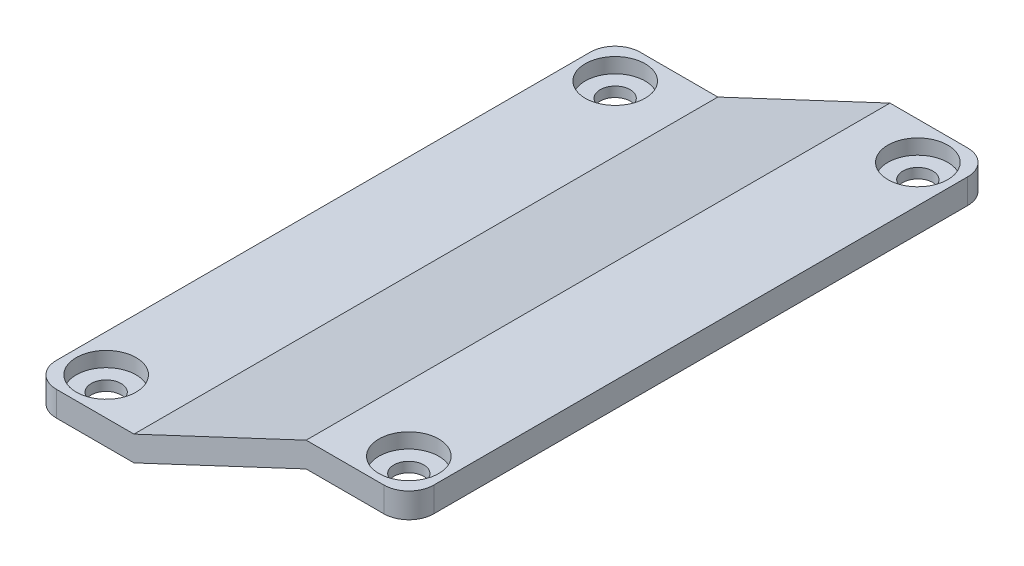
ISO-10303-21;
HEADER;
FILE_DESCRIPTION(('STEP AP214'),'2;1');
FILE_NAME('part.step','',(''),(''),'','','');
FILE_SCHEMA(('AUTOMOTIVE_DESIGN { 1 0 10303 214 1 1 1 1 }'));
ENDSEC;
DATA;
#1=APPLICATION_CONTEXT('core data for automotive mechanical design processes');
#2=APPLICATION_PROTOCOL_DEFINITION('international standard','automotive_design',2000,#1);
#3=PRODUCT_CONTEXT('',#1,'mechanical');
#4=PRODUCT('Part','Part','',(#3));
#5=PRODUCT_RELATED_PRODUCT_CATEGORY('part','',(#4));
#6=PRODUCT_DEFINITION_FORMATION('','',#4);
#7=PRODUCT_DEFINITION_CONTEXT('part definition',#1,'design');
#8=PRODUCT_DEFINITION('design','',#6,#7);
#9=PRODUCT_DEFINITION_SHAPE('','',#8);
#10=(LENGTH_UNIT() NAMED_UNIT(*) SI_UNIT(.MILLI.,.METRE.));
#11=(NAMED_UNIT(*) PLANE_ANGLE_UNIT() SI_UNIT($,.RADIAN.));
#12=(NAMED_UNIT(*) SI_UNIT($,.STERADIAN.) SOLID_ANGLE_UNIT());
#13=UNCERTAINTY_MEASURE_WITH_UNIT(LENGTH_MEASURE(1.E-05),#10,'distance_accuracy_value','');
#14=(GEOMETRIC_REPRESENTATION_CONTEXT(3) GLOBAL_UNCERTAINTY_ASSIGNED_CONTEXT((#13)) GLOBAL_UNIT_ASSIGNED_CONTEXT((#10,
#11,#12)) REPRESENTATION_CONTEXT('',''));
#15=CARTESIAN_POINT('',(0.,0.,0.));
#16=DIRECTION('',(0.,0.,1.));
#17=DIRECTION('',(1.,0.,0.));
#18=AXIS2_PLACEMENT_3D('',#15,#16,#17);
#19=CARTESIAN_POINT('',(-17.5077541769523,-9.56898329219079,-117.));
#20=DIRECTION('',(0.425038765055335,-0.905175147803029,0.));
#21=DIRECTION('',(0.905175147803029,0.425038765055335,0.));
#22=AXIS2_PLACEMENT_3D('',#19,#20,#21);
#23=PLANE('',#22);
#24=DIRECTION('',(0.905175147803029,0.425038765055335,0.));
#25=VECTOR('',#24,1.);
#26=CARTESIAN_POINT('',(-17.5077541769523,-9.56898329219079,0.));
#27=LINE('',#26,#25);
#28=CARTESIAN_POINT('',(-17.5077541769523,-9.56898329219079,0.));
#29=VERTEX_POINT('',#28);
#30=CARTESIAN_POINT('',(16.9922458230477,6.6310167078092,0.));
#31=VERTEX_POINT('',#30);
#32=EDGE_CURVE('E181',#29,#31,#27,.T.);
#33=ORIENTED_EDGE('',*,*,#32,.F.);
#34=DIRECTION('',(0.,0.,1.));
#35=VECTOR('',#34,1.);
#36=CARTESIAN_POINT('',(-17.5077541769523,-9.56898329219079,-117.));
#37=LINE('',#36,#35);
#38=CARTESIAN_POINT('',(-17.5077541769523,-9.56898329219079,-117.));
#39=VERTEX_POINT('',#38);
#40=EDGE_CURVE('E158',#39,#29,#37,.T.);
#41=ORIENTED_EDGE('',*,*,#40,.F.);
#42=DIRECTION('',(0.905175147803029,0.425038765055335,0.));
#43=VECTOR('',#42,1.);
#44=CARTESIAN_POINT('',(-17.5077541769523,-9.56898329219079,-117.));
#45=LINE('',#44,#43);
#46=CARTESIAN_POINT('',(16.9922458230477,6.6310167078092,-117.));
#47=VERTEX_POINT('',#46);
#48=EDGE_CURVE('E149',#39,#47,#45,.T.);
#49=ORIENTED_EDGE('',*,*,#48,.T.);
#50=DIRECTION('',(0.,0.,1.));
#51=VECTOR('',#50,1.);
#52=CARTESIAN_POINT('',(16.9922458230477,6.6310167078092,-117.));
#53=LINE('',#52,#51);
#54=EDGE_CURVE('E131',#47,#31,#53,.T.);
#55=ORIENTED_EDGE('',*,*,#54,.T.);
#56=EDGE_LOOP('',(#33,#41,#49,#55));
#57=FACE_BOUND('',#56,.T.);
#58=ADVANCED_FACE('F41',(#57),#23,.T.);
#59=CARTESIAN_POINT('',(-17.5077541769523,-9.56898329219079,-117.));
#60=DIRECTION('',(0.,-1.,0.));
#61=DIRECTION('',(1.,0.,0.));
#62=AXIS2_PLACEMENT_3D('',#59,#60,#61);
#63=PLANE('',#62);
#64=CARTESIAN_POINT('',(-30.5827541769523,-9.56898329219079,-109.5));
#65=DIRECTION('',(0.,1.,0.));
#66=DIRECTION('',(0.,0.,1.));
#67=AXIS2_PLACEMENT_3D('',#64,#65,#66);
#68=CIRCLE('',#67,3.);
#69=CARTESIAN_POINT('',(-30.5827541769523,-9.56898329219079,-106.5));
#70=VERTEX_POINT('',#69);
#71=EDGE_CURVE('E429',#70,#70,#68,.T.);
#72=ORIENTED_EDGE('',*,*,#71,.T.);
#73=EDGE_LOOP('',(#72));
#74=FACE_BOUND('',#73,.T.);
#75=CARTESIAN_POINT('',(-30.5827541769523,-9.56898329219079,-7.50000000000001));
#76=DIRECTION('',(0.,1.,0.));
#77=DIRECTION('',(0.,0.,1.));
#78=AXIS2_PLACEMENT_3D('',#75,#76,#77);
#79=CIRCLE('',#78,3.);
#80=CARTESIAN_POINT('',(-30.5827541769523,-9.56898329219079,-4.50000000000001));
#81=VERTEX_POINT('',#80);
#82=EDGE_CURVE('E166',#81,#81,#79,.T.);
#83=ORIENTED_EDGE('',*,*,#82,.T.);
#84=EDGE_LOOP('',(#83));
#85=FACE_BOUND('',#84,.T.);
#86=DIRECTION('',(0.,0.,1.));
#87=VECTOR('',#86,1.);
#88=CARTESIAN_POINT('',(-38.0827541769523,-9.5689832921908,-117.));
#89=LINE('',#88,#87);
#90=CARTESIAN_POINT('',(-38.0827541769523,-9.5689832921908,-112.));
#91=VERTEX_POINT('',#90);
#92=CARTESIAN_POINT('',(-38.0827541769523,-9.5689832921908,-5.));
#93=VERTEX_POINT('',#92);
#94=EDGE_CURVE('E199',#91,#93,#89,.T.);
#95=ORIENTED_EDGE('',*,*,#94,.F.);
#96=CARTESIAN_POINT('',(-33.0827541769523,-9.5689832921908,-112.));
#97=DIRECTION('',(0.,-1.,0.));
#98=DIRECTION('',(1.,0.,0.));
#99=AXIS2_PLACEMENT_3D('',#96,#97,#98);
#100=CIRCLE('',#99,5.);
#101=CARTESIAN_POINT('',(-33.0827541769523,-9.5689832921908,-117.));
#102=VERTEX_POINT('',#101);
#103=EDGE_CURVE('E229',#91,#102,#100,.T.);
#104=ORIENTED_EDGE('',*,*,#103,.T.);
#105=DIRECTION('',(1.,0.,0.));
#106=VECTOR('',#105,1.);
#107=CARTESIAN_POINT('',(-17.5077541769523,-9.56898329219079,-117.));
#108=LINE('',#107,#106);
#109=EDGE_CURVE('E143',#102,#39,#108,.T.);
#110=ORIENTED_EDGE('',*,*,#109,.T.);
#111=ORIENTED_EDGE('',*,*,#40,.T.);
#112=DIRECTION('',(1.,0.,0.));
#113=VECTOR('',#112,1.);
#114=CARTESIAN_POINT('',(-17.5077541769523,-9.56898329219079,0.));
#115=LINE('',#114,#113);
#116=CARTESIAN_POINT('',(-33.0827541769523,-9.5689832921908,0.));
#117=VERTEX_POINT('',#116);
#118=EDGE_CURVE('E160',#117,#29,#115,.T.);
#119=ORIENTED_EDGE('',*,*,#118,.F.);
#120=CARTESIAN_POINT('',(-33.0827541769523,-9.5689832921908,-5.));
#121=DIRECTION('',(0.,-1.,0.));
#122=DIRECTION('',(1.,0.,0.));
#123=AXIS2_PLACEMENT_3D('',#120,#121,#122);
#124=CIRCLE('',#123,5.);
#125=EDGE_CURVE('E226',#117,#93,#124,.T.);
#126=ORIENTED_EDGE('',*,*,#125,.T.);
#127=EDGE_LOOP('',(#95,#104,#110,#111,#119,#126));
#128=FACE_BOUND('',#127,.T.);
#129=ADVANCED_FACE('F270',(#74,#85,#128),#63,.T.);
#130=CARTESIAN_POINT('',(-38.0827541769523,-9.5689832921908,-117.));
#131=DIRECTION('',(-1.,0.,0.));
#132=DIRECTION('',(0.,0.,1.));
#133=AXIS2_PLACEMENT_3D('',#130,#131,#132);
#134=PLANE('',#133);
#135=DIRECTION('',(0.,0.,1.));
#136=VECTOR('',#135,1.);
#137=CARTESIAN_POINT('',(-38.0827541769523,-4.5689832921908,-117.));
#138=LINE('',#137,#136);
#139=CARTESIAN_POINT('',(-38.0827541769523,-4.5689832921908,-112.));
#140=VERTEX_POINT('',#139);
#141=CARTESIAN_POINT('',(-38.0827541769523,-4.5689832921908,-5.));
#142=VERTEX_POINT('',#141);
#143=EDGE_CURVE('E203',#140,#142,#138,.T.);
#144=ORIENTED_EDGE('',*,*,#143,.F.);
#145=DIRECTION('',(0.,-1.,0.));
#146=VECTOR('',#145,1.);
#147=CARTESIAN_POINT('',(-38.0827541769523,-9.5689832921908,-112.));
#148=LINE('',#147,#146);
#149=EDGE_CURVE('E222',#140,#91,#148,.T.);
#150=ORIENTED_EDGE('',*,*,#149,.T.);
#151=ORIENTED_EDGE('',*,*,#94,.T.);
#152=DIRECTION('',(0.,-1.,0.));
#153=VECTOR('',#152,1.);
#154=CARTESIAN_POINT('',(-38.0827541769523,-9.5689832921908,-5.));
#155=LINE('',#154,#153);
#156=EDGE_CURVE('E198',#93,#142,#155,.F.);
#157=ORIENTED_EDGE('',*,*,#156,.T.);
#158=EDGE_LOOP('',(#144,#150,#151,#157));
#159=FACE_BOUND('',#158,.T.);
#160=ADVANCED_FACE('F293',(#159),#134,.T.);
#161=CARTESIAN_POINT('',(-17.5077541769523,-4.5689832921908,-117.));
#162=DIRECTION('',(0.,1.,0.));
#163=DIRECTION('',(-1.,0.,0.));
#164=AXIS2_PLACEMENT_3D('',#161,#162,#163);
#165=PLANE('',#164);
#166=CARTESIAN_POINT('',(-30.5827541769523,-4.56898329219079,-109.5));
#167=DIRECTION('',(0.,1.,0.));
#168=DIRECTION('',(0.,0.,1.));
#169=AXIS2_PLACEMENT_3D('',#166,#167,#168);
#170=CIRCLE('',#169,6.);
#171=CARTESIAN_POINT('',(-30.5827541769523,-4.56898329219079,-103.5));
#172=VERTEX_POINT('',#171);
#173=EDGE_CURVE('E417',#172,#172,#170,.T.);
#174=ORIENTED_EDGE('',*,*,#173,.F.);
#175=EDGE_LOOP('',(#174));
#176=FACE_BOUND('',#175,.T.);
#177=CARTESIAN_POINT('',(-30.5827541769523,-4.56898329219079,-7.50000000000001));
#178=DIRECTION('',(0.,1.,0.));
#179=DIRECTION('',(0.,0.,1.));
#180=AXIS2_PLACEMENT_3D('',#177,#178,#179);
#181=CIRCLE('',#180,6.);
#182=CARTESIAN_POINT('',(-30.5827541769523,-4.56898329219079,-1.50000000000001));
#183=VERTEX_POINT('',#182);
#184=EDGE_CURVE('E433',#183,#183,#181,.T.);
#185=ORIENTED_EDGE('',*,*,#184,.F.);
#186=EDGE_LOOP('',(#185));
#187=FACE_BOUND('',#186,.T.);
#188=DIRECTION('',(-1.,0.,0.));
#189=VECTOR('',#188,1.);
#190=CARTESIAN_POINT('',(-17.5077541769523,-4.5689832921908,-117.));
#191=LINE('',#190,#189);
#192=CARTESIAN_POINT('',(-17.5077541769523,-4.5689832921908,-117.));
#193=VERTEX_POINT('',#192);
#194=CARTESIAN_POINT('',(-33.0827541769523,-4.5689832921908,-117.));
#195=VERTEX_POINT('',#194);
#196=EDGE_CURVE('E175',#193,#195,#191,.T.);
#197=ORIENTED_EDGE('',*,*,#196,.T.);
#198=CARTESIAN_POINT('',(-33.0827541769523,-4.5689832921908,-112.));
#199=DIRECTION('',(0.,1.,0.));
#200=DIRECTION('',(-1.,0.,0.));
#201=AXIS2_PLACEMENT_3D('',#198,#199,#200);
#202=CIRCLE('',#201,5.);
#203=EDGE_CURVE('E240',#195,#140,#202,.T.);
#204=ORIENTED_EDGE('',*,*,#203,.T.);
#205=ORIENTED_EDGE('',*,*,#143,.T.);
#206=CARTESIAN_POINT('',(-33.0827541769523,-4.5689832921908,-5.));
#207=DIRECTION('',(0.,1.,0.));
#208=DIRECTION('',(-1.,0.,0.));
#209=AXIS2_PLACEMENT_3D('',#206,#207,#208);
#210=CIRCLE('',#209,5.);
#211=CARTESIAN_POINT('',(-33.0827541769523,-4.5689832921908,0.));
#212=VERTEX_POINT('',#211);
#213=EDGE_CURVE('E237',#142,#212,#210,.T.);
#214=ORIENTED_EDGE('',*,*,#213,.T.);
#215=DIRECTION('',(-1.,0.,0.));
#216=VECTOR('',#215,1.);
#217=CARTESIAN_POINT('',(-17.5077541769523,-4.5689832921908,0.));
#218=LINE('',#217,#216);
#219=CARTESIAN_POINT('',(-17.5077541769523,-4.5689832921908,0.));
#220=VERTEX_POINT('',#219);
#221=EDGE_CURVE('E163',#220,#212,#218,.T.);
#222=ORIENTED_EDGE('',*,*,#221,.F.);
#223=DIRECTION('',(0.,0.,1.));
#224=VECTOR('',#223,1.);
#225=CARTESIAN_POINT('',(-17.5077541769523,-4.5689832921908,-117.));
#226=LINE('',#225,#224);
#227=EDGE_CURVE('E207',#193,#220,#226,.T.);
#228=ORIENTED_EDGE('',*,*,#227,.F.);
#229=EDGE_LOOP('',(#197,#204,#205,#214,#222,#228));
#230=FACE_BOUND('',#229,.T.);
#231=ADVANCED_FACE('F289',(#176,#187,#230),#165,.T.);
#232=CARTESIAN_POINT('',(-17.5077541769523,-4.5689832921908,-117.));
#233=DIRECTION('',(-0.425038765055335,0.905175147803029,0.));
#234=DIRECTION('',(-0.905175147803029,-0.425038765055335,0.));
#235=AXIS2_PLACEMENT_3D('',#232,#233,#234);
#236=PLANE('',#235);
#237=DIRECTION('',(-0.905175147803029,-0.425038765055335,0.));
#238=VECTOR('',#237,1.);
#239=CARTESIAN_POINT('',(-17.5077541769523,-4.5689832921908,0.));
#240=LINE('',#239,#238);
#241=CARTESIAN_POINT('',(16.9922458230477,11.6310167078092,0.));
#242=VERTEX_POINT('',#241);
#243=EDGE_CURVE('E189',#242,#220,#240,.T.);
#244=ORIENTED_EDGE('',*,*,#243,.F.);
#245=DIRECTION('',(0.,0.,1.));
#246=VECTOR('',#245,1.);
#247=CARTESIAN_POINT('',(16.9922458230477,11.6310167078092,-117.));
#248=LINE('',#247,#246);
#249=CARTESIAN_POINT('',(16.9922458230477,11.6310167078092,-117.));
#250=VERTEX_POINT('',#249);
#251=EDGE_CURVE('E210',#250,#242,#248,.T.);
#252=ORIENTED_EDGE('',*,*,#251,.F.);
#253=DIRECTION('',(-0.905175147803029,-0.425038765055335,0.));
#254=VECTOR('',#253,1.);
#255=CARTESIAN_POINT('',(-17.5077541769523,-4.5689832921908,-117.));
#256=LINE('',#255,#254);
#257=EDGE_CURVE('E171',#250,#193,#256,.T.);
#258=ORIENTED_EDGE('',*,*,#257,.T.);
#259=ORIENTED_EDGE('',*,*,#227,.T.);
#260=EDGE_LOOP('',(#244,#252,#258,#259));
#261=FACE_BOUND('',#260,.T.);
#262=ADVANCED_FACE('F285',(#261),#236,.T.);
#263=CARTESIAN_POINT('',(16.9922458230477,11.6310167078092,-117.));
#264=DIRECTION('',(0.,1.,0.));
#265=DIRECTION('',(-1.,0.,0.));
#266=AXIS2_PLACEMENT_3D('',#263,#264,#265);
#267=PLANE('',#266);
#268=CARTESIAN_POINT('',(30.0672458230477,11.6310167078092,-7.5));
#269=DIRECTION('',(0.,1.,0.));
#270=DIRECTION('',(0.,0.,1.));
#271=AXIS2_PLACEMENT_3D('',#268,#269,#270);
#272=CIRCLE('',#271,6.);
#273=CARTESIAN_POINT('',(30.0672458230477,11.6310167078092,-1.5));
#274=VERTEX_POINT('',#273);
#275=EDGE_CURVE('E389',#274,#274,#272,.T.);
#276=ORIENTED_EDGE('',*,*,#275,.F.);
#277=EDGE_LOOP('',(#276));
#278=FACE_BOUND('',#277,.T.);
#279=CARTESIAN_POINT('',(30.0672458230477,11.6310167078092,-109.5));
#280=DIRECTION('',(0.,1.,0.));
#281=DIRECTION('',(0.,0.,1.));
#282=AXIS2_PLACEMENT_3D('',#279,#280,#281);
#283=CIRCLE('',#282,6.);
#284=CARTESIAN_POINT('',(30.0672458230477,11.6310167078092,-103.5));
#285=VERTEX_POINT('',#284);
#286=EDGE_CURVE('E401',#285,#285,#283,.T.);
#287=ORIENTED_EDGE('',*,*,#286,.F.);
#288=EDGE_LOOP('',(#287));
#289=FACE_BOUND('',#288,.T.);
#290=DIRECTION('',(0.,0.,1.));
#291=VECTOR('',#290,1.);
#292=CARTESIAN_POINT('',(37.5672458230477,11.6310167078092,-117.));
#293=LINE('',#292,#291);
#294=CARTESIAN_POINT('',(37.5672458230477,11.6310167078092,-112.));
#295=VERTEX_POINT('',#294);
#296=CARTESIAN_POINT('',(37.5672458230477,11.6310167078092,-5.));
#297=VERTEX_POINT('',#296);
#298=EDGE_CURVE('E214',#295,#297,#293,.T.);
#299=ORIENTED_EDGE('',*,*,#298,.F.);
#300=CARTESIAN_POINT('',(32.5672458230477,11.6310167078092,-112.));
#301=DIRECTION('',(0.,1.,0.));
#302=DIRECTION('',(-1.,0.,0.));
#303=AXIS2_PLACEMENT_3D('',#300,#301,#302);
#304=CIRCLE('',#303,5.);
#305=CARTESIAN_POINT('',(32.5672458230477,11.6310167078092,-117.));
#306=VERTEX_POINT('',#305);
#307=EDGE_CURVE('E252',#295,#306,#304,.T.);
#308=ORIENTED_EDGE('',*,*,#307,.T.);
#309=DIRECTION('',(-1.,0.,0.));
#310=VECTOR('',#309,1.);
#311=CARTESIAN_POINT('',(16.9922458230477,11.6310167078092,-117.));
#312=LINE('',#311,#310);
#313=EDGE_CURVE('E154',#306,#250,#312,.T.);
#314=ORIENTED_EDGE('',*,*,#313,.T.);
#315=ORIENTED_EDGE('',*,*,#251,.T.);
#316=DIRECTION('',(-1.,0.,0.));
#317=VECTOR('',#316,1.);
#318=CARTESIAN_POINT('',(16.9922458230477,11.6310167078092,0.));
#319=LINE('',#318,#317);
#320=CARTESIAN_POINT('',(32.5672458230477,11.6310167078092,0.));
#321=VERTEX_POINT('',#320);
#322=EDGE_CURVE('E186',#321,#242,#319,.T.);
#323=ORIENTED_EDGE('',*,*,#322,.F.);
#324=CARTESIAN_POINT('',(32.5672458230477,11.6310167078092,-5.));
#325=DIRECTION('',(0.,1.,0.));
#326=DIRECTION('',(-1.,0.,0.));
#327=AXIS2_PLACEMENT_3D('',#324,#325,#326);
#328=CIRCLE('',#327,5.);
#329=EDGE_CURVE('E65',#321,#297,#328,.T.);
#330=ORIENTED_EDGE('',*,*,#329,.T.);
#331=EDGE_LOOP('',(#299,#308,#314,#315,#323,#330));
#332=FACE_BOUND('',#331,.T.);
#333=ADVANCED_FACE('F281',(#278,#289,#332),#267,.T.);
#334=CARTESIAN_POINT('',(37.5672458230477,6.6310167078092,-117.));
#335=DIRECTION('',(1.,0.,0.));
#336=DIRECTION('',(0.,0.,-1.));
#337=AXIS2_PLACEMENT_3D('',#334,#335,#336);
#338=PLANE('',#337);
#339=DIRECTION('',(0.,0.,1.));
#340=VECTOR('',#339,1.);
#341=CARTESIAN_POINT('',(37.5672458230477,6.6310167078092,-117.));
#342=LINE('',#341,#340);
#343=CARTESIAN_POINT('',(37.5672458230477,6.6310167078092,-112.));
#344=VERTEX_POINT('',#343);
#345=CARTESIAN_POINT('',(37.5672458230477,6.6310167078092,-5.));
#346=VERTEX_POINT('',#345);
#347=EDGE_CURVE('E142',#344,#346,#342,.T.);
#348=ORIENTED_EDGE('',*,*,#347,.F.);
#349=DIRECTION('',(0.,1.,0.));
#350=VECTOR('',#349,1.);
#351=CARTESIAN_POINT('',(37.5672458230477,11.6310167078092,-112.));
#352=LINE('',#351,#350);
#353=EDGE_CURVE('E246',#344,#295,#352,.T.);
#354=ORIENTED_EDGE('',*,*,#353,.T.);
#355=ORIENTED_EDGE('',*,*,#298,.T.);
#356=DIRECTION('',(0.,1.,0.));
#357=VECTOR('',#356,1.);
#358=CARTESIAN_POINT('',(37.5672458230477,6.6310167078092,-5.));
#359=LINE('',#358,#357);
#360=EDGE_CURVE('E243',#297,#346,#359,.F.);
#361=ORIENTED_EDGE('',*,*,#360,.T.);
#362=EDGE_LOOP('',(#348,#354,#355,#361));
#363=FACE_BOUND('',#362,.T.);
#364=ADVANCED_FACE('F275',(#363),#338,.T.);
#365=CARTESIAN_POINT('',(16.9922458230477,6.6310167078092,-117.));
#366=DIRECTION('',(0.,-1.,0.));
#367=DIRECTION('',(0.,0.,-1.));
#368=AXIS2_PLACEMENT_3D('',#365,#366,#367);
#369=PLANE('',#368);
#370=CARTESIAN_POINT('',(30.0672458230477,6.6310167078092,-7.5));
#371=DIRECTION('',(0.,-1.,0.));
#372=DIRECTION('',(0.,0.,-1.));
#373=AXIS2_PLACEMENT_3D('',#370,#371,#372);
#374=CIRCLE('',#373,3.);
#375=CARTESIAN_POINT('',(30.0672458230477,6.6310167078092,-10.5));
#376=VERTEX_POINT('',#375);
#377=EDGE_CURVE('E393',#376,#376,#374,.T.);
#378=ORIENTED_EDGE('',*,*,#377,.F.);
#379=EDGE_LOOP('',(#378));
#380=FACE_BOUND('',#379,.T.);
#381=CARTESIAN_POINT('',(30.0672458230477,6.6310167078092,-109.5));
#382=DIRECTION('',(0.,-1.,0.));
#383=DIRECTION('',(0.,0.,-1.));
#384=AXIS2_PLACEMENT_3D('',#381,#382,#383);
#385=CIRCLE('',#384,3.);
#386=CARTESIAN_POINT('',(30.0672458230477,6.6310167078092,-112.5));
#387=VERTEX_POINT('',#386);
#388=EDGE_CURVE('E413',#387,#387,#385,.T.);
#389=ORIENTED_EDGE('',*,*,#388,.F.);
#390=EDGE_LOOP('',(#389));
#391=FACE_BOUND('',#390,.T.);
#392=DIRECTION('',(1.,0.,0.));
#393=VECTOR('',#392,1.);
#394=CARTESIAN_POINT('',(16.9922458230477,6.6310167078092,-117.));
#395=LINE('',#394,#393);
#396=CARTESIAN_POINT('',(32.5672458230477,6.6310167078092,-117.));
#397=VERTEX_POINT('',#396);
#398=EDGE_CURVE('E134',#47,#397,#395,.T.);
#399=ORIENTED_EDGE('',*,*,#398,.T.);
#400=CARTESIAN_POINT('',(32.5672458230477,6.6310167078092,-112.));
#401=DIRECTION('',(0.,-1.,0.));
#402=DIRECTION('',(0.,0.,-1.));
#403=AXIS2_PLACEMENT_3D('',#400,#401,#402);
#404=CIRCLE('',#403,5.);
#405=EDGE_CURVE('E257',#397,#344,#404,.T.);
#406=ORIENTED_EDGE('',*,*,#405,.T.);
#407=ORIENTED_EDGE('',*,*,#347,.T.);
#408=CARTESIAN_POINT('',(32.5672458230477,6.6310167078092,-5.));
#409=DIRECTION('',(0.,-1.,0.));
#410=DIRECTION('',(0.,0.,-1.));
#411=AXIS2_PLACEMENT_3D('',#408,#409,#410);
#412=CIRCLE('',#411,5.);
#413=CARTESIAN_POINT('',(32.5672458230477,6.6310167078092,0.));
#414=VERTEX_POINT('',#413);
#415=EDGE_CURVE('E57',#346,#414,#412,.T.);
#416=ORIENTED_EDGE('',*,*,#415,.T.);
#417=DIRECTION('',(1.,0.,0.));
#418=VECTOR('',#417,1.);
#419=CARTESIAN_POINT('',(16.9922458230477,6.6310167078092,0.));
#420=LINE('',#419,#418);
#421=EDGE_CURVE('E136',#31,#414,#420,.T.);
#422=ORIENTED_EDGE('',*,*,#421,.F.);
#423=ORIENTED_EDGE('',*,*,#54,.F.);
#424=EDGE_LOOP('',(#399,#406,#407,#416,#422,#423));
#425=FACE_BOUND('',#424,.T.);
#426=ADVANCED_FACE('F133',(#380,#391,#425),#369,.T.);
#427=CARTESIAN_POINT('',(0.,0.,-117.));
#428=DIRECTION('',(0.,0.,1.));
#429=DIRECTION('',(1.,0.,0.));
#430=AXIS2_PLACEMENT_3D('',#427,#428,#429);
#431=PLANE('',#430);
#432=ORIENTED_EDGE('',*,*,#109,.F.);
#433=DIRECTION('',(0.,-1.,0.));
#434=VECTOR('',#433,1.);
#435=CARTESIAN_POINT('',(-33.0827541769523,-4.5689832921908,-117.));
#436=LINE('',#435,#434);
#437=EDGE_CURVE('E234',#102,#195,#436,.F.);
#438=ORIENTED_EDGE('',*,*,#437,.T.);
#439=ORIENTED_EDGE('',*,*,#196,.F.);
#440=ORIENTED_EDGE('',*,*,#257,.F.);
#441=ORIENTED_EDGE('',*,*,#313,.F.);
#442=DIRECTION('',(0.,1.,0.));
#443=VECTOR('',#442,1.);
#444=CARTESIAN_POINT('',(32.5672458230477,6.6310167078092,-117.));
#445=LINE('',#444,#443);
#446=EDGE_CURVE('E152',#306,#397,#445,.F.);
#447=ORIENTED_EDGE('',*,*,#446,.T.);
#448=ORIENTED_EDGE('',*,*,#398,.F.);
#449=ORIENTED_EDGE('',*,*,#48,.F.);
#450=EDGE_LOOP('',(#432,#438,#439,#440,#441,#447,#448,#449));
#451=FACE_BOUND('',#450,.T.);
#452=ADVANCED_FACE('F148',(#451),#431,.F.);
#453=CARTESIAN_POINT('',(0.,0.,0.));
#454=DIRECTION('',(0.,0.,1.));
#455=DIRECTION('',(1.,0.,0.));
#456=AXIS2_PLACEMENT_3D('',#453,#454,#455);
#457=PLANE('',#456);
#458=ORIENTED_EDGE('',*,*,#421,.T.);
#459=DIRECTION('',(0.,1.,0.));
#460=VECTOR('',#459,1.);
#461=CARTESIAN_POINT('',(32.5672458230477,0.,0.));
#462=LINE('',#461,#460);
#463=EDGE_CURVE('E11',#414,#321,#462,.T.);
#464=ORIENTED_EDGE('',*,*,#463,.T.);
#465=ORIENTED_EDGE('',*,*,#322,.T.);
#466=ORIENTED_EDGE('',*,*,#243,.T.);
#467=ORIENTED_EDGE('',*,*,#221,.T.);
#468=DIRECTION('',(0.,-1.,0.));
#469=VECTOR('',#468,1.);
#470=CARTESIAN_POINT('',(-33.0827541769523,0.,0.));
#471=LINE('',#470,#469);
#472=EDGE_CURVE('E50',#212,#117,#471,.T.);
#473=ORIENTED_EDGE('',*,*,#472,.T.);
#474=ORIENTED_EDGE('',*,*,#118,.T.);
#475=ORIENTED_EDGE('',*,*,#32,.T.);
#476=EDGE_LOOP('',(#458,#464,#465,#466,#467,#473,#474,#475));
#477=FACE_BOUND('',#476,.T.);
#478=ADVANCED_FACE('F264',(#477),#457,.T.);
#479=CARTESIAN_POINT('',(-30.5827541769523,-4.56898329219079,-7.50000000000001));
#480=DIRECTION('',(0.,1.,0.));
#481=DIRECTION('',(0.,0.,1.));
#482=AXIS2_PLACEMENT_3D('',#479,#480,#481);
#483=CYLINDRICAL_SURFACE('',#482,3.);
#484=ORIENTED_EDGE('',*,*,#82,.F.);
#485=EDGE_LOOP('',(#484));
#486=FACE_BOUND('',#485,.T.);
#487=CARTESIAN_POINT('',(-30.5827541769523,-7.56898329219079,-7.50000000000001));
#488=DIRECTION('',(0.,1.,0.));
#489=DIRECTION('',(0.,0.,1.));
#490=AXIS2_PLACEMENT_3D('',#487,#488,#489);
#491=CIRCLE('',#490,3.);
#492=CARTESIAN_POINT('',(-30.5827541769523,-7.56898329219079,-4.50000000000001));
#493=VERTEX_POINT('',#492);
#494=EDGE_CURVE('E440',#493,#493,#491,.T.);
#495=ORIENTED_EDGE('',*,*,#494,.T.);
#496=EDGE_LOOP('',(#495));
#497=FACE_BOUND('',#496,.T.);
#498=ADVANCED_FACE('F335',(#486,#497),#483,.F.);
#499=CARTESIAN_POINT('',(-27.5827541769523,-7.56898329219079,-7.50000000000001));
#500=DIRECTION('',(0.,-1.,0.));
#501=DIRECTION('',(0.,0.,-1.));
#502=AXIS2_PLACEMENT_3D('',#499,#500,#501);
#503=PLANE('',#502);
#504=ORIENTED_EDGE('',*,*,#494,.F.);
#505=EDGE_LOOP('',(#504));
#506=FACE_BOUND('',#505,.T.);
#507=CARTESIAN_POINT('',(-30.5827541769523,-7.56898329219079,-7.50000000000001));
#508=DIRECTION('',(0.,1.,0.));
#509=DIRECTION('',(0.,0.,1.));
#510=AXIS2_PLACEMENT_3D('',#507,#508,#509);
#511=CIRCLE('',#510,6.);
#512=CARTESIAN_POINT('',(-30.5827541769523,-7.56898329219079,-1.50000000000001));
#513=VERTEX_POINT('',#512);
#514=EDGE_CURVE('E437',#513,#513,#511,.T.);
#515=ORIENTED_EDGE('',*,*,#514,.T.);
#516=EDGE_LOOP('',(#515));
#517=FACE_BOUND('',#516,.T.);
#518=ADVANCED_FACE('F340',(#506,#517),#503,.F.);
#519=CARTESIAN_POINT('',(-30.5827541769523,-4.56898329219079,-7.50000000000001));
#520=DIRECTION('',(0.,1.,0.));
#521=DIRECTION('',(0.,0.,1.));
#522=AXIS2_PLACEMENT_3D('',#519,#520,#521);
#523=CYLINDRICAL_SURFACE('',#522,6.);
#524=ORIENTED_EDGE('',*,*,#514,.F.);
#525=EDGE_LOOP('',(#524));
#526=FACE_BOUND('',#525,.T.);
#527=ORIENTED_EDGE('',*,*,#184,.T.);
#528=EDGE_LOOP('',(#527));
#529=FACE_BOUND('',#528,.T.);
#530=ADVANCED_FACE('F344',(#526,#529),#523,.F.);
#531=CARTESIAN_POINT('',(-30.5827541769523,-4.56898329219079,-109.5));
#532=DIRECTION('',(0.,1.,0.));
#533=DIRECTION('',(0.,0.,1.));
#534=AXIS2_PLACEMENT_3D('',#531,#532,#533);
#535=CYLINDRICAL_SURFACE('',#534,3.);
#536=ORIENTED_EDGE('',*,*,#71,.F.);
#537=EDGE_LOOP('',(#536));
#538=FACE_BOUND('',#537,.T.);
#539=CARTESIAN_POINT('',(-30.5827541769523,-7.56898329219079,-109.5));
#540=DIRECTION('',(0.,1.,0.));
#541=DIRECTION('',(0.,0.,1.));
#542=AXIS2_PLACEMENT_3D('',#539,#540,#541);
#543=CIRCLE('',#542,3.);
#544=CARTESIAN_POINT('',(-30.5827541769523,-7.56898329219079,-106.5));
#545=VERTEX_POINT('',#544);
#546=EDGE_CURVE('E425',#545,#545,#543,.T.);
#547=ORIENTED_EDGE('',*,*,#546,.T.);
#548=EDGE_LOOP('',(#547));
#549=FACE_BOUND('',#548,.T.);
#550=ADVANCED_FACE('F348',(#538,#549),#535,.F.);
#551=CARTESIAN_POINT('',(-27.5827541769523,-7.56898329219079,-109.5));
#552=DIRECTION('',(0.,-1.,0.));
#553=DIRECTION('',(0.,0.,-1.));
#554=AXIS2_PLACEMENT_3D('',#551,#552,#553);
#555=PLANE('',#554);
#556=ORIENTED_EDGE('',*,*,#546,.F.);
#557=EDGE_LOOP('',(#556));
#558=FACE_BOUND('',#557,.T.);
#559=CARTESIAN_POINT('',(-30.5827541769523,-7.56898329219079,-109.5));
#560=DIRECTION('',(0.,1.,0.));
#561=DIRECTION('',(0.,0.,1.));
#562=AXIS2_PLACEMENT_3D('',#559,#560,#561);
#563=CIRCLE('',#562,6.);
#564=CARTESIAN_POINT('',(-30.5827541769523,-7.56898329219079,-103.5));
#565=VERTEX_POINT('',#564);
#566=EDGE_CURVE('E421',#565,#565,#563,.T.);
#567=ORIENTED_EDGE('',*,*,#566,.T.);
#568=EDGE_LOOP('',(#567));
#569=FACE_BOUND('',#568,.T.);
#570=ADVANCED_FACE('F352',(#558,#569),#555,.F.);
#571=CARTESIAN_POINT('',(-30.5827541769523,-4.56898329219079,-109.5));
#572=DIRECTION('',(0.,1.,0.));
#573=DIRECTION('',(0.,0.,1.));
#574=AXIS2_PLACEMENT_3D('',#571,#572,#573);
#575=CYLINDRICAL_SURFACE('',#574,6.);
#576=ORIENTED_EDGE('',*,*,#566,.F.);
#577=EDGE_LOOP('',(#576));
#578=FACE_BOUND('',#577,.T.);
#579=ORIENTED_EDGE('',*,*,#173,.T.);
#580=EDGE_LOOP('',(#579));
#581=FACE_BOUND('',#580,.T.);
#582=ADVANCED_FACE('F356',(#578,#581),#575,.F.);
#583=CARTESIAN_POINT('',(30.0672458230477,11.6310167078092,-109.5));
#584=DIRECTION('',(0.,1.,0.));
#585=DIRECTION('',(0.,0.,1.));
#586=AXIS2_PLACEMENT_3D('',#583,#584,#585);
#587=CYLINDRICAL_SURFACE('',#586,3.);
#588=CARTESIAN_POINT('',(30.0672458230477,8.6310167078092,-109.5));
#589=DIRECTION('',(0.,1.,0.));
#590=DIRECTION('',(0.,0.,1.));
#591=AXIS2_PLACEMENT_3D('',#588,#589,#590);
#592=CIRCLE('',#591,3.);
#593=CARTESIAN_POINT('',(30.0672458230477,8.6310167078092,-106.5));
#594=VERTEX_POINT('',#593);
#595=EDGE_CURVE('E409',#594,#594,#592,.T.);
#596=ORIENTED_EDGE('',*,*,#595,.T.);
#597=EDGE_LOOP('',(#596));
#598=FACE_BOUND('',#597,.T.);
#599=ORIENTED_EDGE('',*,*,#388,.T.);
#600=EDGE_LOOP('',(#599));
#601=FACE_BOUND('',#600,.T.);
#602=ADVANCED_FACE('F360',(#598,#601),#587,.F.);
#603=CARTESIAN_POINT('',(33.0672458230477,8.6310167078092,-109.5));
#604=DIRECTION('',(0.,-1.,0.));
#605=DIRECTION('',(0.,0.,-1.));
#606=AXIS2_PLACEMENT_3D('',#603,#604,#605);
#607=PLANE('',#606);
#608=ORIENTED_EDGE('',*,*,#595,.F.);
#609=EDGE_LOOP('',(#608));
#610=FACE_BOUND('',#609,.T.);
#611=CARTESIAN_POINT('',(30.0672458230477,8.6310167078092,-109.5));
#612=DIRECTION('',(0.,1.,0.));
#613=DIRECTION('',(0.,0.,1.));
#614=AXIS2_PLACEMENT_3D('',#611,#612,#613);
#615=CIRCLE('',#614,6.);
#616=CARTESIAN_POINT('',(30.0672458230477,8.6310167078092,-103.5));
#617=VERTEX_POINT('',#616);
#618=EDGE_CURVE('E405',#617,#617,#615,.T.);
#619=ORIENTED_EDGE('',*,*,#618,.T.);
#620=EDGE_LOOP('',(#619));
#621=FACE_BOUND('',#620,.T.);
#622=ADVANCED_FACE('F364',(#610,#621),#607,.F.);
#623=CARTESIAN_POINT('',(30.0672458230477,11.6310167078092,-109.5));
#624=DIRECTION('',(0.,1.,0.));
#625=DIRECTION('',(0.,0.,1.));
#626=AXIS2_PLACEMENT_3D('',#623,#624,#625);
#627=CYLINDRICAL_SURFACE('',#626,6.);
#628=ORIENTED_EDGE('',*,*,#618,.F.);
#629=EDGE_LOOP('',(#628));
#630=FACE_BOUND('',#629,.T.);
#631=ORIENTED_EDGE('',*,*,#286,.T.);
#632=EDGE_LOOP('',(#631));
#633=FACE_BOUND('',#632,.T.);
#634=ADVANCED_FACE('F368',(#630,#633),#627,.F.);
#635=CARTESIAN_POINT('',(30.0672458230477,11.6310167078092,-7.5));
#636=DIRECTION('',(0.,1.,0.));
#637=DIRECTION('',(0.,0.,1.));
#638=AXIS2_PLACEMENT_3D('',#635,#636,#637);
#639=CYLINDRICAL_SURFACE('',#638,3.);
#640=CARTESIAN_POINT('',(30.0672458230477,8.6310167078092,-7.5));
#641=DIRECTION('',(0.,1.,0.));
#642=DIRECTION('',(0.,0.,1.));
#643=AXIS2_PLACEMENT_3D('',#640,#641,#642);
#644=CIRCLE('',#643,3.);
#645=CARTESIAN_POINT('',(30.0672458230477,8.6310167078092,-4.5));
#646=VERTEX_POINT('',#645);
#647=EDGE_CURVE('E384',#646,#646,#644,.T.);
#648=ORIENTED_EDGE('',*,*,#647,.T.);
#649=EDGE_LOOP('',(#648));
#650=FACE_BOUND('',#649,.T.);
#651=ORIENTED_EDGE('',*,*,#377,.T.);
#652=EDGE_LOOP('',(#651));
#653=FACE_BOUND('',#652,.T.);
#654=ADVANCED_FACE('F372',(#650,#653),#639,.F.);
#655=CARTESIAN_POINT('',(33.0672458230477,8.6310167078092,-7.5));
#656=DIRECTION('',(0.,-1.,0.));
#657=DIRECTION('',(0.,0.,-1.));
#658=AXIS2_PLACEMENT_3D('',#655,#656,#657);
#659=PLANE('',#658);
#660=ORIENTED_EDGE('',*,*,#647,.F.);
#661=EDGE_LOOP('',(#660));
#662=FACE_BOUND('',#661,.T.);
#663=CARTESIAN_POINT('',(30.0672458230477,8.6310167078092,-7.5));
#664=DIRECTION('',(0.,1.,0.));
#665=DIRECTION('',(0.,0.,1.));
#666=AXIS2_PLACEMENT_3D('',#663,#664,#665);
#667=CIRCLE('',#666,6.);
#668=CARTESIAN_POINT('',(30.0672458230477,8.6310167078092,-1.5));
#669=VERTEX_POINT('',#668);
#670=EDGE_CURVE('E387',#669,#669,#667,.T.);
#671=ORIENTED_EDGE('',*,*,#670,.T.);
#672=EDGE_LOOP('',(#671));
#673=FACE_BOUND('',#672,.T.);
#674=ADVANCED_FACE('F307',(#662,#673),#659,.F.);
#675=CARTESIAN_POINT('',(30.0672458230477,11.6310167078092,-7.5));
#676=DIRECTION('',(0.,1.,0.));
#677=DIRECTION('',(0.,0.,1.));
#678=AXIS2_PLACEMENT_3D('',#675,#676,#677);
#679=CYLINDRICAL_SURFACE('',#678,6.);
#680=ORIENTED_EDGE('',*,*,#670,.F.);
#681=EDGE_LOOP('',(#680));
#682=FACE_BOUND('',#681,.T.);
#683=ORIENTED_EDGE('',*,*,#275,.T.);
#684=EDGE_LOOP('',(#683));
#685=FACE_BOUND('',#684,.T.);
#686=ADVANCED_FACE('F300',(#682,#685),#679,.F.);
#687=CARTESIAN_POINT('',(-33.0827541769523,-9.5689832921908,-112.));
#688=DIRECTION('',(0.,1.,0.));
#689=DIRECTION('',(0.,0.,1.));
#690=AXIS2_PLACEMENT_3D('',#687,#688,#689);
#691=CYLINDRICAL_SURFACE('',#690,5.);
#692=ORIENTED_EDGE('',*,*,#203,.F.);
#693=ORIENTED_EDGE('',*,*,#437,.F.);
#694=ORIENTED_EDGE('',*,*,#103,.F.);
#695=ORIENTED_EDGE('',*,*,#149,.F.);
#696=EDGE_LOOP('',(#692,#693,#694,#695));
#697=FACE_BOUND('',#696,.T.);
#698=ADVANCED_FACE('F298',(#697),#691,.T.);
#699=CARTESIAN_POINT('',(32.5672458230477,6.6310167078092,-112.));
#700=DIRECTION('',(0.,-1.,0.));
#701=DIRECTION('',(0.,0.,-1.));
#702=AXIS2_PLACEMENT_3D('',#699,#700,#701);
#703=CYLINDRICAL_SURFACE('',#702,5.);
#704=ORIENTED_EDGE('',*,*,#405,.F.);
#705=ORIENTED_EDGE('',*,*,#446,.F.);
#706=ORIENTED_EDGE('',*,*,#307,.F.);
#707=ORIENTED_EDGE('',*,*,#353,.F.);
#708=EDGE_LOOP('',(#704,#705,#706,#707));
#709=FACE_BOUND('',#708,.T.);
#710=ADVANCED_FACE('F279',(#709),#703,.T.);
#711=CARTESIAN_POINT('',(32.5672458230477,0.,-5.));
#712=DIRECTION('',(0.,1.,0.));
#713=DIRECTION('',(0.,0.,1.));
#714=AXIS2_PLACEMENT_3D('',#711,#712,#713);
#715=CYLINDRICAL_SURFACE('',#714,5.);
#716=ORIENTED_EDGE('',*,*,#415,.F.);
#717=ORIENTED_EDGE('',*,*,#360,.F.);
#718=ORIENTED_EDGE('',*,*,#329,.F.);
#719=ORIENTED_EDGE('',*,*,#463,.F.);
#720=EDGE_LOOP('',(#716,#717,#718,#719));
#721=FACE_BOUND('',#720,.T.);
#722=ADVANCED_FACE('F272',(#721),#715,.T.);
#723=CARTESIAN_POINT('',(-33.0827541769523,0.,-5.));
#724=DIRECTION('',(0.,-1.,0.));
#725=DIRECTION('',(0.,0.,-1.));
#726=AXIS2_PLACEMENT_3D('',#723,#724,#725);
#727=CYLINDRICAL_SURFACE('',#726,5.);
#728=ORIENTED_EDGE('',*,*,#213,.F.);
#729=ORIENTED_EDGE('',*,*,#156,.F.);
#730=ORIENTED_EDGE('',*,*,#125,.F.);
#731=ORIENTED_EDGE('',*,*,#472,.F.);
#732=EDGE_LOOP('',(#728,#729,#730,#731));
#733=FACE_BOUND('',#732,.T.);
#734=ADVANCED_FACE('F43',(#733),#727,.T.);
#735=CLOSED_SHELL('',(#58,#129,#160,#231,#262,#333,#364,#426,#452,#478,#498,#518,#530,#550,#570,
#582,#602,#622,#634,#654,#674,#686,#698,#710,#722,#734));
#736=MANIFOLD_SOLID_BREP('B2',#735);
#737=ADVANCED_BREP_SHAPE_REPRESENTATION('',(#18,#736),#14);
#738=SHAPE_DEFINITION_REPRESENTATION(#9,#737);
ENDSEC;
END-ISO-10303-21;
